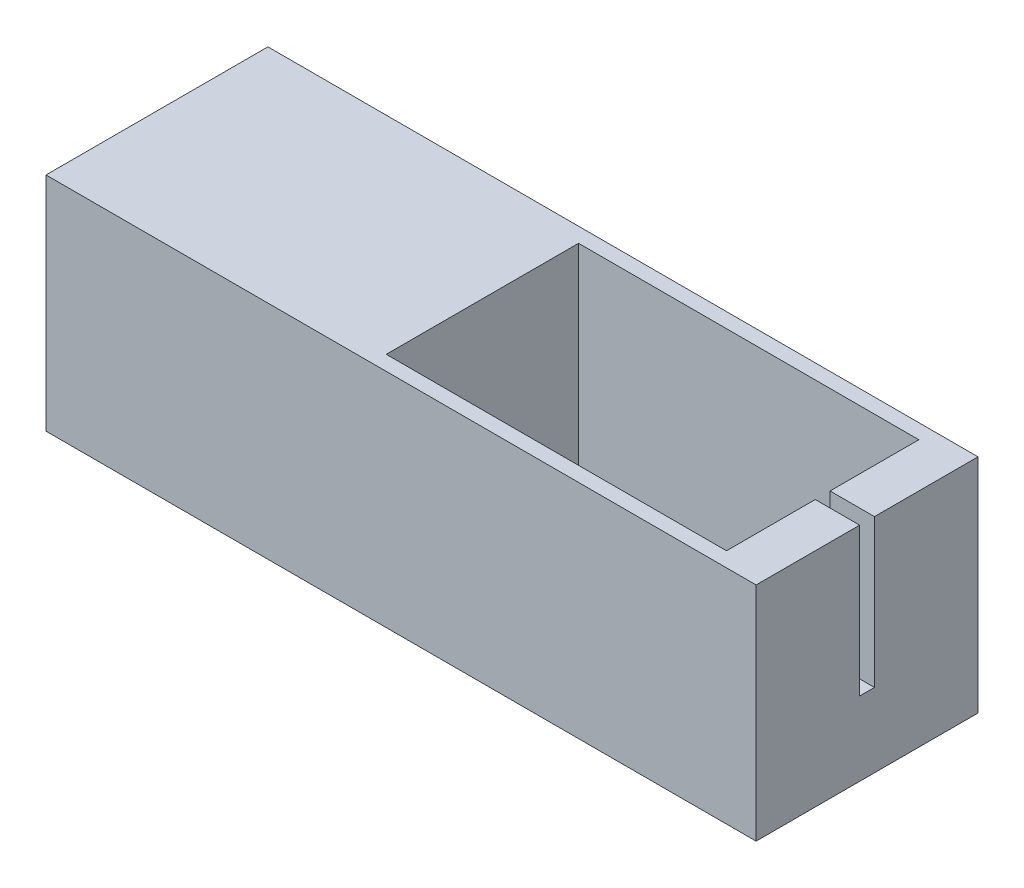
ISO-10303-21;
HEADER;
FILE_DESCRIPTION(('STEP AP214'),'2;1');
FILE_NAME('part.step','',(''),(''),'','','');
FILE_SCHEMA(('AUTOMOTIVE_DESIGN { 1 0 10303 214 1 1 1 1 }'));
ENDSEC;
DATA;
#1=APPLICATION_CONTEXT('core data for automotive mechanical design processes');
#2=APPLICATION_PROTOCOL_DEFINITION('international standard','automotive_design',2000,#1);
#3=PRODUCT_CONTEXT('',#1,'mechanical');
#4=PRODUCT('Part','Part','',(#3));
#5=PRODUCT_RELATED_PRODUCT_CATEGORY('part','',(#4));
#6=PRODUCT_DEFINITION_FORMATION('','',#4);
#7=PRODUCT_DEFINITION_CONTEXT('part definition',#1,'design');
#8=PRODUCT_DEFINITION('design','',#6,#7);
#9=PRODUCT_DEFINITION_SHAPE('','',#8);
#10=(LENGTH_UNIT() NAMED_UNIT(*) SI_UNIT(.MILLI.,.METRE.));
#11=(NAMED_UNIT(*) PLANE_ANGLE_UNIT() SI_UNIT($,.RADIAN.));
#12=(NAMED_UNIT(*) SI_UNIT($,.STERADIAN.) SOLID_ANGLE_UNIT());
#13=UNCERTAINTY_MEASURE_WITH_UNIT(LENGTH_MEASURE(1.E-05),#10,'distance_accuracy_value','');
#14=(GEOMETRIC_REPRESENTATION_CONTEXT(3) GLOBAL_UNCERTAINTY_ASSIGNED_CONTEXT((#13)) GLOBAL_UNIT_ASSIGNED_CONTEXT((#10,
#11,#12)) REPRESENTATION_CONTEXT('',''));
#15=CARTESIAN_POINT('',(0.,0.,0.));
#16=DIRECTION('',(0.,0.,1.));
#17=DIRECTION('',(1.,0.,0.));
#18=AXIS2_PLACEMENT_3D('',#15,#16,#17);
#19=CARTESIAN_POINT('',(0.,15.,0.));
#20=DIRECTION('',(0.,1.,0.));
#21=DIRECTION('',(0.,0.,1.));
#22=AXIS2_PLACEMENT_3D('',#19,#20,#21);
#23=PLANE('',#22);
#24=DIRECTION('',(0.,0.,-1.));
#25=VECTOR('',#24,1.);
#26=CARTESIAN_POINT('',(40.5,15.,0.));
#27=LINE('',#26,#25);
#28=CARTESIAN_POINT('',(40.5,15.,-0.5));
#29=VERTEX_POINT('',#28);
#30=CARTESIAN_POINT('',(40.5,15.,-6.50000000000001));
#31=VERTEX_POINT('',#30);
#32=EDGE_CURVE('E187',#29,#31,#27,.T.);
#33=ORIENTED_EDGE('',*,*,#32,.F.);
#34=DIRECTION('',(1.,0.,0.));
#35=VECTOR('',#34,1.);
#36=CARTESIAN_POINT('',(-4.501,15.,-0.499999999999988));
#37=LINE('',#36,#35);
#38=CARTESIAN_POINT('',(43.5,15.,-0.5));
#39=VERTEX_POINT('',#38);
#40=EDGE_CURVE('E180',#29,#39,#37,.T.);
#41=ORIENTED_EDGE('',*,*,#40,.T.);
#42=DIRECTION('',(0.,0.,1.));
#43=VECTOR('',#42,1.);
#44=CARTESIAN_POINT('',(43.5,15.,7.49999999999999));
#45=LINE('',#44,#43);
#46=CARTESIAN_POINT('',(43.5,15.,-7.50000000000001));
#47=VERTEX_POINT('',#46);
#48=EDGE_CURVE('E248',#47,#39,#45,.T.);
#49=ORIENTED_EDGE('',*,*,#48,.F.);
#50=DIRECTION('',(-1.,0.,0.));
#51=VECTOR('',#50,1.);
#52=CARTESIAN_POINT('',(-4.5,15.,-7.5));
#53=LINE('',#52,#51);
#54=CARTESIAN_POINT('',(-4.5,15.,-7.5));
#55=VERTEX_POINT('',#54);
#56=EDGE_CURVE('E230',#47,#55,#53,.T.);
#57=ORIENTED_EDGE('',*,*,#56,.T.);
#58=DIRECTION('',(0.,0.,1.));
#59=VECTOR('',#58,1.);
#60=CARTESIAN_POINT('',(-4.5,15.,-7.5));
#61=LINE('',#60,#59);
#62=CARTESIAN_POINT('',(-4.5,15.,7.5));
#63=VERTEX_POINT('',#62);
#64=EDGE_CURVE('E245',#55,#63,#61,.T.);
#65=ORIENTED_EDGE('',*,*,#64,.T.);
#66=DIRECTION('',(1.,0.,0.));
#67=VECTOR('',#66,1.);
#68=CARTESIAN_POINT('',(-4.5,15.,7.5));
#69=LINE('',#68,#67);
#70=CARTESIAN_POINT('',(43.5,15.,7.49999999999999));
#71=VERTEX_POINT('',#70);
#72=EDGE_CURVE('E243',#63,#71,#69,.T.);
#73=ORIENTED_EDGE('',*,*,#72,.T.);
#74=CARTESIAN_POINT('',(43.5,15.,0.5));
#75=VERTEX_POINT('',#74);
#76=EDGE_CURVE('E178',#75,#71,#45,.T.);
#77=ORIENTED_EDGE('',*,*,#76,.F.);
#78=DIRECTION('',(1.,0.,0.));
#79=VECTOR('',#78,1.);
#80=CARTESIAN_POINT('',(-4.501,15.,0.500000000000012));
#81=LINE('',#80,#79);
#82=CARTESIAN_POINT('',(40.5,15.,0.500000000000012));
#83=VERTEX_POINT('',#82);
#84=EDGE_CURVE('E163',#83,#75,#81,.T.);
#85=ORIENTED_EDGE('',*,*,#84,.F.);
#86=CARTESIAN_POINT('',(40.5,15.,6.49999999999999));
#87=VERTEX_POINT('',#86);
#88=EDGE_CURVE('E176',#87,#83,#27,.T.);
#89=ORIENTED_EDGE('',*,*,#88,.F.);
#90=DIRECTION('',(1.,0.,0.));
#91=VECTOR('',#90,1.);
#92=CARTESIAN_POINT('',(0.,15.,6.49999999999999));
#93=LINE('',#92,#91);
#94=CARTESIAN_POINT('',(17.5,15.,6.49999999999999));
#95=VERTEX_POINT('',#94);
#96=EDGE_CURVE('E57',#95,#87,#93,.T.);
#97=ORIENTED_EDGE('',*,*,#96,.F.);
#98=DIRECTION('',(0.,0.,1.));
#99=VECTOR('',#98,1.);
#100=CARTESIAN_POINT('',(17.5,15.,0.));
#101=LINE('',#100,#99);
#102=CARTESIAN_POINT('',(17.5,15.,-6.50000000000001));
#103=VERTEX_POINT('',#102);
#104=EDGE_CURVE('E12',#103,#95,#101,.T.);
#105=ORIENTED_EDGE('',*,*,#104,.F.);
#106=DIRECTION('',(-1.,0.,0.));
#107=VECTOR('',#106,1.);
#108=CARTESIAN_POINT('',(0.,15.,-6.50000000000001));
#109=LINE('',#108,#107);
#110=EDGE_CURVE('E189',#31,#103,#109,.T.);
#111=ORIENTED_EDGE('',*,*,#110,.F.);
#112=EDGE_LOOP('',(#33,#41,#49,#57,#65,#73,#77,#85,#89,#97,#105,#111));
#113=FACE_BOUND('',#112,.T.);
#114=ADVANCED_FACE('F49',(#113),#23,.T.);
#115=CARTESIAN_POINT('',(43.5,0.,0.));
#116=DIRECTION('',(1.,0.,0.));
#117=DIRECTION('',(0.,0.,-1.));
#118=AXIS2_PLACEMENT_3D('',#115,#116,#117);
#119=PLANE('',#118);
#120=ORIENTED_EDGE('',*,*,#48,.T.);
#121=DIRECTION('',(0.,-1.,0.));
#122=VECTOR('',#121,1.);
#123=CARTESIAN_POINT('',(43.5,15.,-0.5));
#124=LINE('',#123,#122);
#125=CARTESIAN_POINT('',(43.5,5.,-0.500000000000001));
#126=VERTEX_POINT('',#125);
#127=EDGE_CURVE('E279',#39,#126,#124,.T.);
#128=ORIENTED_EDGE('',*,*,#127,.T.);
#129=DIRECTION('',(0.,0.,1.));
#130=VECTOR('',#129,1.);
#131=CARTESIAN_POINT('',(43.5,5.,-0.500000000000001));
#132=LINE('',#131,#130);
#133=CARTESIAN_POINT('',(43.5,5.,0.499999999999999));
#134=VERTEX_POINT('',#133);
#135=EDGE_CURVE('E285',#126,#134,#132,.T.);
#136=ORIENTED_EDGE('',*,*,#135,.T.);
#137=DIRECTION('',(0.,-1.,0.));
#138=VECTOR('',#137,1.);
#139=CARTESIAN_POINT('',(43.5,15.,0.5));
#140=LINE('',#139,#138);
#141=EDGE_CURVE('E168',#75,#134,#140,.T.);
#142=ORIENTED_EDGE('',*,*,#141,.F.);
#143=ORIENTED_EDGE('',*,*,#76,.T.);
#144=DIRECTION('',(0.,-1.,0.));
#145=VECTOR('',#144,1.);
#146=CARTESIAN_POINT('',(43.5,15.,7.49999999999999));
#147=LINE('',#146,#145);
#148=CARTESIAN_POINT('',(43.5,0.,7.49999999999999));
#149=VERTEX_POINT('',#148);
#150=EDGE_CURVE('E257',#71,#149,#147,.T.);
#151=ORIENTED_EDGE('',*,*,#150,.T.);
#152=DIRECTION('',(0.,0.,-1.));
#153=VECTOR('',#152,1.);
#154=CARTESIAN_POINT('',(43.5,0.,7.49999999999999));
#155=LINE('',#154,#153);
#156=CARTESIAN_POINT('',(43.5,0.,-7.50000000000001));
#157=VERTEX_POINT('',#156);
#158=EDGE_CURVE('E254',#149,#157,#155,.T.);
#159=ORIENTED_EDGE('',*,*,#158,.T.);
#160=DIRECTION('',(0.,1.,0.));
#161=VECTOR('',#160,1.);
#162=CARTESIAN_POINT('',(43.5,15.,-7.50000000000001));
#163=LINE('',#162,#161);
#164=EDGE_CURVE('E251',#157,#47,#163,.T.);
#165=ORIENTED_EDGE('',*,*,#164,.T.);
#166=EDGE_LOOP('',(#120,#128,#136,#142,#143,#151,#159,#165));
#167=FACE_BOUND('',#166,.T.);
#168=ADVANCED_FACE('F321',(#167),#119,.T.);
#169=CARTESIAN_POINT('',(40.5,24.,6.49999999999999));
#170=DIRECTION('',(1.,0.,0.));
#171=DIRECTION('',(0.,0.,-1.));
#172=AXIS2_PLACEMENT_3D('',#169,#170,#171);
#173=PLANE('',#172);
#174=DIRECTION('',(0.,1.,0.));
#175=VECTOR('',#174,1.);
#176=CARTESIAN_POINT('',(40.5,15.,-0.499999999999999));
#177=LINE('',#176,#175);
#178=CARTESIAN_POINT('',(40.5,5.,-0.500000000000001));
#179=VERTEX_POINT('',#178);
#180=EDGE_CURVE('E169',#179,#29,#177,.T.);
#181=ORIENTED_EDGE('',*,*,#180,.T.);
#182=ORIENTED_EDGE('',*,*,#32,.T.);
#183=DIRECTION('',(0.,-1.,0.));
#184=VECTOR('',#183,1.);
#185=CARTESIAN_POINT('',(40.5,24.,-6.50000000000001));
#186=LINE('',#185,#184);
#187=CARTESIAN_POINT('',(40.5,0.,-6.50000000000001));
#188=VERTEX_POINT('',#187);
#189=EDGE_CURVE('E263',#31,#188,#186,.T.);
#190=ORIENTED_EDGE('',*,*,#189,.T.);
#191=DIRECTION('',(0.,0.,1.));
#192=VECTOR('',#191,1.);
#193=CARTESIAN_POINT('',(40.5,0.,6.49999999999999));
#194=LINE('',#193,#192);
#195=CARTESIAN_POINT('',(40.5,0.,6.49999999999999));
#196=VERTEX_POINT('',#195);
#197=EDGE_CURVE('E270',#188,#196,#194,.T.);
#198=ORIENTED_EDGE('',*,*,#197,.T.);
#199=DIRECTION('',(0.,-1.,0.));
#200=VECTOR('',#199,1.);
#201=CARTESIAN_POINT('',(40.5,24.,6.49999999999999));
#202=LINE('',#201,#200);
#203=EDGE_CURVE('E186',#87,#196,#202,.T.);
#204=ORIENTED_EDGE('',*,*,#203,.F.);
#205=ORIENTED_EDGE('',*,*,#88,.T.);
#206=DIRECTION('',(0.,1.,0.));
#207=VECTOR('',#206,1.);
#208=CARTESIAN_POINT('',(40.5,15.,0.500000000000001));
#209=LINE('',#208,#207);
#210=CARTESIAN_POINT('',(40.5,5.,0.499999999999999));
#211=VERTEX_POINT('',#210);
#212=EDGE_CURVE('E160',#211,#83,#209,.T.);
#213=ORIENTED_EDGE('',*,*,#212,.F.);
#214=DIRECTION('',(0.,0.,-1.));
#215=VECTOR('',#214,1.);
#216=CARTESIAN_POINT('',(40.5,5.,-0.500000000000013));
#217=LINE('',#216,#215);
#218=EDGE_CURVE('E179',#211,#179,#217,.T.);
#219=ORIENTED_EDGE('',*,*,#218,.T.);
#220=EDGE_LOOP('',(#181,#182,#190,#198,#204,#205,#213,#219));
#221=FACE_BOUND('',#220,.T.);
#222=ADVANCED_FACE('F184',(#221),#173,.F.);
#223=CARTESIAN_POINT('',(-4.5,0.,-7.5));
#224=DIRECTION('',(-1.,0.,0.));
#225=DIRECTION('',(0.,0.,1.));
#226=AXIS2_PLACEMENT_3D('',#223,#224,#225);
#227=PLANE('',#226);
#228=DIRECTION('',(0.,1.,0.));
#229=VECTOR('',#228,1.);
#230=CARTESIAN_POINT('',(-4.5,0.,7.5));
#231=LINE('',#230,#229);
#232=CARTESIAN_POINT('',(-4.5,0.,7.5));
#233=VERTEX_POINT('',#232);
#234=EDGE_CURVE('E193',#233,#63,#231,.T.);
#235=ORIENTED_EDGE('',*,*,#234,.T.);
#236=ORIENTED_EDGE('',*,*,#64,.F.);
#237=DIRECTION('',(0.,1.,0.));
#238=VECTOR('',#237,1.);
#239=CARTESIAN_POINT('',(-4.5,0.,-7.5));
#240=LINE('',#239,#238);
#241=CARTESIAN_POINT('',(-4.5,0.,-7.5));
#242=VERTEX_POINT('',#241);
#243=EDGE_CURVE('E192',#242,#55,#240,.T.);
#244=ORIENTED_EDGE('',*,*,#243,.F.);
#245=DIRECTION('',(0.,0.,1.));
#246=VECTOR('',#245,1.);
#247=CARTESIAN_POINT('',(-4.5,0.,-7.5));
#248=LINE('',#247,#246);
#249=EDGE_CURVE('E201',#242,#233,#248,.T.);
#250=ORIENTED_EDGE('',*,*,#249,.T.);
#251=EDGE_LOOP('',(#235,#236,#244,#250));
#252=FACE_BOUND('',#251,.T.);
#253=ADVANCED_FACE('F51',(#252),#227,.T.);
#254=CARTESIAN_POINT('',(-4.5,0.,-7.5));
#255=DIRECTION('',(0.,0.,-1.));
#256=DIRECTION('',(-1.,0.,0.));
#257=AXIS2_PLACEMENT_3D('',#254,#255,#256);
#258=PLANE('',#257);
#259=ORIENTED_EDGE('',*,*,#243,.T.);
#260=ORIENTED_EDGE('',*,*,#56,.F.);
#261=ORIENTED_EDGE('',*,*,#164,.F.);
#262=DIRECTION('',(-1.,0.,0.));
#263=VECTOR('',#262,1.);
#264=CARTESIAN_POINT('',(-4.5,0.,-7.5));
#265=LINE('',#264,#263);
#266=EDGE_CURVE('E195',#157,#242,#265,.T.);
#267=ORIENTED_EDGE('',*,*,#266,.T.);
#268=EDGE_LOOP('',(#259,#260,#261,#267));
#269=FACE_BOUND('',#268,.T.);
#270=ADVANCED_FACE('F319',(#269),#258,.T.);
#271=CARTESIAN_POINT('',(-4.5,0.,7.5));
#272=DIRECTION('',(0.,0.,1.));
#273=DIRECTION('',(1.,0.,0.));
#274=AXIS2_PLACEMENT_3D('',#271,#272,#273);
#275=PLANE('',#274);
#276=DIRECTION('',(1.,0.,0.));
#277=VECTOR('',#276,1.);
#278=CARTESIAN_POINT('',(-4.5,0.,7.5));
#279=LINE('',#278,#277);
#280=EDGE_CURVE('E199',#233,#149,#279,.T.);
#281=ORIENTED_EDGE('',*,*,#280,.T.);
#282=ORIENTED_EDGE('',*,*,#150,.F.);
#283=ORIENTED_EDGE('',*,*,#72,.F.);
#284=ORIENTED_EDGE('',*,*,#234,.F.);
#285=EDGE_LOOP('',(#281,#282,#283,#284));
#286=FACE_BOUND('',#285,.T.);
#287=ADVANCED_FACE('F309',(#286),#275,.T.);
#288=CARTESIAN_POINT('',(0.,0.,0.));
#289=DIRECTION('',(0.,1.,0.));
#290=DIRECTION('',(0.,0.,1.));
#291=AXIS2_PLACEMENT_3D('',#288,#289,#290);
#292=PLANE('',#291);
#293=DIRECTION('',(1.,0.,0.));
#294=VECTOR('',#293,1.);
#295=CARTESIAN_POINT('',(17.5,0.,-6.50000000000001));
#296=LINE('',#295,#294);
#297=CARTESIAN_POINT('',(17.5,0.,-6.50000000000001));
#298=VERTEX_POINT('',#297);
#299=EDGE_CURVE('E272',#298,#188,#296,.T.);
#300=ORIENTED_EDGE('',*,*,#299,.F.);
#301=DIRECTION('',(0.,0.,-1.));
#302=VECTOR('',#301,1.);
#303=CARTESIAN_POINT('',(17.5,0.,6.49999999999999));
#304=LINE('',#303,#302);
#305=CARTESIAN_POINT('',(17.5,0.,6.49999999999999));
#306=VERTEX_POINT('',#305);
#307=EDGE_CURVE('E72',#306,#298,#304,.T.);
#308=ORIENTED_EDGE('',*,*,#307,.F.);
#309=DIRECTION('',(-1.,0.,0.));
#310=VECTOR('',#309,1.);
#311=CARTESIAN_POINT('',(17.5,0.,6.49999999999999));
#312=LINE('',#311,#310);
#313=EDGE_CURVE('E264',#196,#306,#312,.T.);
#314=ORIENTED_EDGE('',*,*,#313,.F.);
#315=ORIENTED_EDGE('',*,*,#197,.F.);
#316=EDGE_LOOP('',(#300,#308,#314,#315));
#317=FACE_BOUND('',#316,.T.);
#318=DIRECTION('',(-0.994270148012847,0.,-0.106896551724138));
#319=VECTOR('',#318,1.);
#320=CARTESIAN_POINT('',(14.7084482758621,0.,-1.93882678862505));
#321=LINE('',#320,#319);
#322=CARTESIAN_POINT('',(14.7084482758621,0.,-1.93882678862505));
#323=VERTEX_POINT('',#322);
#324=CARTESIAN_POINT('',(0.374137931034483,0.,-3.47994551804496));
#325=VERTEX_POINT('',#324);
#326=EDGE_CURVE('E209',#323,#325,#321,.T.);
#327=ORIENTED_EDGE('',*,*,#326,.T.);
#328=CARTESIAN_POINT('',(0.,0.,0.));
#329=DIRECTION('',(0.,1.,0.));
#330=DIRECTION('',(0.,0.,1.));
#331=AXIS2_PLACEMENT_3D('',#328,#329,#330);
#332=CIRCLE('',#331,3.5);
#333=CARTESIAN_POINT('',(0.374137931034482,0.,3.47994551804497));
#334=VERTEX_POINT('',#333);
#335=EDGE_CURVE('E220',#325,#334,#332,.T.);
#336=ORIENTED_EDGE('',*,*,#335,.T.);
#337=DIRECTION('',(0.994270148012847,0.,-0.106896551724138));
#338=VECTOR('',#337,1.);
#339=CARTESIAN_POINT('',(0.374137931034482,0.,3.47994551804497));
#340=LINE('',#339,#338);
#341=CARTESIAN_POINT('',(14.7084482758621,0.,1.93882678862505));
#342=VERTEX_POINT('',#341);
#343=EDGE_CURVE('E236',#334,#342,#340,.T.);
#344=ORIENTED_EDGE('',*,*,#343,.T.);
#345=CARTESIAN_POINT('',(14.5,0.,0.));
#346=DIRECTION('',(0.,1.,0.));
#347=DIRECTION('',(0.,0.,1.));
#348=AXIS2_PLACEMENT_3D('',#345,#346,#347);
#349=CIRCLE('',#348,1.95);
#350=EDGE_CURVE('E233',#342,#323,#349,.T.);
#351=ORIENTED_EDGE('',*,*,#350,.T.);
#352=EDGE_LOOP('',(#327,#336,#344,#351));
#353=FACE_BOUND('',#352,.T.);
#354=ORIENTED_EDGE('',*,*,#249,.F.);
#355=ORIENTED_EDGE('',*,*,#266,.F.);
#356=ORIENTED_EDGE('',*,*,#158,.F.);
#357=ORIENTED_EDGE('',*,*,#280,.F.);
#358=EDGE_LOOP('',(#354,#355,#356,#357));
#359=FACE_BOUND('',#358,.T.);
#360=ADVANCED_FACE('F305',(#317,#353,#359),#292,.F.);
#361=CARTESIAN_POINT('',(0.,0.,0.));
#362=DIRECTION('',(0.,1.,0.));
#363=DIRECTION('',(0.,0.,1.));
#364=AXIS2_PLACEMENT_3D('',#361,#362,#363);
#365=CYLINDRICAL_SURFACE('',#364,3.5);
#366=CARTESIAN_POINT('',(0.,5.,0.));
#367=DIRECTION('',(0.,1.,0.));
#368=DIRECTION('',(0.,0.,1.));
#369=AXIS2_PLACEMENT_3D('',#366,#367,#368);
#370=CIRCLE('',#369,3.5);
#371=CARTESIAN_POINT('',(0.374137931034483,5.,-3.47994551804496));
#372=VERTEX_POINT('',#371);
#373=CARTESIAN_POINT('',(0.374137931034482,5.,3.47994551804496));
#374=VERTEX_POINT('',#373);
#375=EDGE_CURVE('E227',#372,#374,#370,.T.);
#376=ORIENTED_EDGE('',*,*,#375,.T.);
#377=DIRECTION('',(0.,1.,0.));
#378=VECTOR('',#377,1.);
#379=CARTESIAN_POINT('',(0.374137931034482,0.,3.47994551804497));
#380=LINE('',#379,#378);
#381=EDGE_CURVE('E205',#334,#374,#380,.T.);
#382=ORIENTED_EDGE('',*,*,#381,.F.);
#383=ORIENTED_EDGE('',*,*,#335,.F.);
#384=DIRECTION('',(0.,1.,0.));
#385=VECTOR('',#384,1.);
#386=CARTESIAN_POINT('',(0.374137931034483,0.,-3.47994551804496));
#387=LINE('',#386,#385);
#388=EDGE_CURVE('E204',#325,#372,#387,.T.);
#389=ORIENTED_EDGE('',*,*,#388,.T.);
#390=EDGE_LOOP('',(#376,#382,#383,#389));
#391=FACE_BOUND('',#390,.T.);
#392=ADVANCED_FACE('F308',(#391),#365,.F.);
#393=CARTESIAN_POINT('',(14.7084482758621,0.,-1.93882678862505));
#394=DIRECTION('',(0.106896551724138,0.,-0.994270148012847));
#395=DIRECTION('',(-0.994270148012847,0.,-0.106896551724138));
#396=AXIS2_PLACEMENT_3D('',#393,#394,#395);
#397=PLANE('',#396);
#398=DIRECTION('',(-0.994270148012847,0.,-0.106896551724138));
#399=VECTOR('',#398,1.);
#400=CARTESIAN_POINT('',(14.7084482758621,5.,-1.93882678862505));
#401=LINE('',#400,#399);
#402=CARTESIAN_POINT('',(14.7084482758621,5.,-1.93882678862505));
#403=VERTEX_POINT('',#402);
#404=EDGE_CURVE('E217',#403,#372,#401,.T.);
#405=ORIENTED_EDGE('',*,*,#404,.T.);
#406=ORIENTED_EDGE('',*,*,#388,.F.);
#407=ORIENTED_EDGE('',*,*,#326,.F.);
#408=DIRECTION('',(0.,1.,0.));
#409=VECTOR('',#408,1.);
#410=CARTESIAN_POINT('',(14.7084482758621,0.,-1.93882678862505));
#411=LINE('',#410,#409);
#412=EDGE_CURVE('E212',#323,#403,#411,.T.);
#413=ORIENTED_EDGE('',*,*,#412,.T.);
#414=EDGE_LOOP('',(#405,#406,#407,#413));
#415=FACE_BOUND('',#414,.T.);
#416=ADVANCED_FACE('F351',(#415),#397,.F.);
#417=CARTESIAN_POINT('',(14.5,0.,0.));
#418=DIRECTION('',(0.,1.,0.));
#419=DIRECTION('',(0.,0.,1.));
#420=AXIS2_PLACEMENT_3D('',#417,#418,#419);
#421=CYLINDRICAL_SURFACE('',#420,1.95);
#422=CARTESIAN_POINT('',(14.5,5.,0.));
#423=DIRECTION('',(0.,1.,0.));
#424=DIRECTION('',(0.,0.,1.));
#425=AXIS2_PLACEMENT_3D('',#422,#423,#424);
#426=CIRCLE('',#425,1.95);
#427=CARTESIAN_POINT('',(14.7084482758621,5.,1.93882678862505));
#428=VERTEX_POINT('',#427);
#429=EDGE_CURVE('E221',#428,#403,#426,.T.);
#430=ORIENTED_EDGE('',*,*,#429,.T.);
#431=ORIENTED_EDGE('',*,*,#412,.F.);
#432=ORIENTED_EDGE('',*,*,#350,.F.);
#433=DIRECTION('',(0.,1.,0.));
#434=VECTOR('',#433,1.);
#435=CARTESIAN_POINT('',(14.7084482758621,0.,1.93882678862505));
#436=LINE('',#435,#434);
#437=EDGE_CURVE('E208',#342,#428,#436,.T.);
#438=ORIENTED_EDGE('',*,*,#437,.T.);
#439=EDGE_LOOP('',(#430,#431,#432,#438));
#440=FACE_BOUND('',#439,.T.);
#441=ADVANCED_FACE('F354',(#440),#421,.F.);
#442=CARTESIAN_POINT('',(0.374137931034482,0.,3.47994551804497));
#443=DIRECTION('',(0.106896551724138,0.,0.994270148012847));
#444=DIRECTION('',(0.994270148012847,0.,-0.106896551724138));
#445=AXIS2_PLACEMENT_3D('',#442,#443,#444);
#446=PLANE('',#445);
#447=DIRECTION('',(0.994270148012847,0.,-0.106896551724138));
#448=VECTOR('',#447,1.);
#449=CARTESIAN_POINT('',(0.374137931034482,5.,3.47994551804497));
#450=LINE('',#449,#448);
#451=EDGE_CURVE('E224',#374,#428,#450,.T.);
#452=ORIENTED_EDGE('',*,*,#451,.T.);
#453=ORIENTED_EDGE('',*,*,#437,.F.);
#454=ORIENTED_EDGE('',*,*,#343,.F.);
#455=ORIENTED_EDGE('',*,*,#381,.T.);
#456=EDGE_LOOP('',(#452,#453,#454,#455));
#457=FACE_BOUND('',#456,.T.);
#458=ADVANCED_FACE('F349',(#457),#446,.F.);
#459=CARTESIAN_POINT('',(0.,5.,0.));
#460=DIRECTION('',(0.,1.,0.));
#461=DIRECTION('',(0.,0.,1.));
#462=AXIS2_PLACEMENT_3D('',#459,#460,#461);
#463=PLANE('',#462);
#464=ORIENTED_EDGE('',*,*,#375,.F.);
#465=ORIENTED_EDGE('',*,*,#404,.F.);
#466=ORIENTED_EDGE('',*,*,#429,.F.);
#467=ORIENTED_EDGE('',*,*,#451,.F.);
#468=EDGE_LOOP('',(#464,#465,#466,#467));
#469=FACE_BOUND('',#468,.T.);
#470=ADVANCED_FACE('F346',(#469),#463,.F.);
#471=CARTESIAN_POINT('',(17.5,24.,6.49999999999999));
#472=DIRECTION('',(-1.,0.,0.));
#473=DIRECTION('',(0.,0.,1.));
#474=AXIS2_PLACEMENT_3D('',#471,#472,#473);
#475=PLANE('',#474);
#476=ORIENTED_EDGE('',*,*,#104,.T.);
#477=DIRECTION('',(0.,-1.,0.));
#478=VECTOR('',#477,1.);
#479=CARTESIAN_POINT('',(17.5,24.,6.49999999999999));
#480=LINE('',#479,#478);
#481=EDGE_CURVE('E260',#95,#306,#480,.T.);
#482=ORIENTED_EDGE('',*,*,#481,.T.);
#483=ORIENTED_EDGE('',*,*,#307,.T.);
#484=DIRECTION('',(0.,-1.,0.));
#485=VECTOR('',#484,1.);
#486=CARTESIAN_POINT('',(17.5,24.,-6.50000000000001));
#487=LINE('',#486,#485);
#488=EDGE_CURVE('E261',#103,#298,#487,.T.);
#489=ORIENTED_EDGE('',*,*,#488,.F.);
#490=EDGE_LOOP('',(#476,#482,#483,#489));
#491=FACE_BOUND('',#490,.T.);
#492=ADVANCED_FACE('F298',(#491),#475,.F.);
#493=CARTESIAN_POINT('',(17.5,24.,6.49999999999999));
#494=DIRECTION('',(0.,0.,1.));
#495=DIRECTION('',(1.,0.,0.));
#496=AXIS2_PLACEMENT_3D('',#493,#494,#495);
#497=PLANE('',#496);
#498=ORIENTED_EDGE('',*,*,#96,.T.);
#499=ORIENTED_EDGE('',*,*,#203,.T.);
#500=ORIENTED_EDGE('',*,*,#313,.T.);
#501=ORIENTED_EDGE('',*,*,#481,.F.);
#502=EDGE_LOOP('',(#498,#499,#500,#501));
#503=FACE_BOUND('',#502,.T.);
#504=ADVANCED_FACE('F301',(#503),#497,.F.);
#505=CARTESIAN_POINT('',(17.5,24.,-6.50000000000001));
#506=DIRECTION('',(0.,0.,-1.));
#507=DIRECTION('',(-1.,0.,0.));
#508=AXIS2_PLACEMENT_3D('',#505,#506,#507);
#509=PLANE('',#508);
#510=ORIENTED_EDGE('',*,*,#110,.T.);
#511=ORIENTED_EDGE('',*,*,#488,.T.);
#512=ORIENTED_EDGE('',*,*,#299,.T.);
#513=ORIENTED_EDGE('',*,*,#189,.F.);
#514=EDGE_LOOP('',(#510,#511,#512,#513));
#515=FACE_BOUND('',#514,.T.);
#516=ADVANCED_FACE('F296',(#515),#509,.F.);
#517=CARTESIAN_POINT('',(-4.501,5.,-0.499999999999989));
#518=DIRECTION('',(0.,1.,0.));
#519=DIRECTION('',(-1.,0.,0.));
#520=AXIS2_PLACEMENT_3D('',#517,#518,#519);
#521=PLANE('',#520);
#522=DIRECTION('',(1.,0.,0.));
#523=VECTOR('',#522,1.);
#524=CARTESIAN_POINT('',(-4.501,5.,0.500000000000011));
#525=LINE('',#524,#523);
#526=EDGE_CURVE('E64',#211,#134,#525,.T.);
#527=ORIENTED_EDGE('',*,*,#526,.T.);
#528=ORIENTED_EDGE('',*,*,#135,.F.);
#529=DIRECTION('',(1.,0.,0.));
#530=VECTOR('',#529,1.);
#531=CARTESIAN_POINT('',(-4.501,5.,-0.499999999999989));
#532=LINE('',#531,#530);
#533=EDGE_CURVE('E278',#179,#126,#532,.T.);
#534=ORIENTED_EDGE('',*,*,#533,.F.);
#535=ORIENTED_EDGE('',*,*,#218,.F.);
#536=EDGE_LOOP('',(#527,#528,#534,#535));
#537=FACE_BOUND('',#536,.T.);
#538=ADVANCED_FACE('F328',(#537),#521,.T.);
#539=CARTESIAN_POINT('',(-4.501,15.,-0.499999999999988));
#540=DIRECTION('',(0.,0.,1.));
#541=DIRECTION('',(1.,0.,0.));
#542=AXIS2_PLACEMENT_3D('',#539,#540,#541);
#543=PLANE('',#542);
#544=ORIENTED_EDGE('',*,*,#533,.T.);
#545=ORIENTED_EDGE('',*,*,#127,.F.);
#546=ORIENTED_EDGE('',*,*,#40,.F.);
#547=ORIENTED_EDGE('',*,*,#180,.F.);
#548=EDGE_LOOP('',(#544,#545,#546,#547));
#549=FACE_BOUND('',#548,.T.);
#550=ADVANCED_FACE('F329',(#549),#543,.T.);
#551=CARTESIAN_POINT('',(-4.501,15.,0.500000000000012));
#552=DIRECTION('',(0.,0.,1.));
#553=DIRECTION('',(1.,0.,0.));
#554=AXIS2_PLACEMENT_3D('',#551,#552,#553);
#555=PLANE('',#554);
#556=ORIENTED_EDGE('',*,*,#212,.T.);
#557=ORIENTED_EDGE('',*,*,#84,.T.);
#558=ORIENTED_EDGE('',*,*,#141,.T.);
#559=ORIENTED_EDGE('',*,*,#526,.F.);
#560=EDGE_LOOP('',(#556,#557,#558,#559));
#561=FACE_BOUND('',#560,.T.);
#562=ADVANCED_FACE('F162',(#561),#555,.F.);
#563=CLOSED_SHELL('',(#114,#168,#222,#253,#270,#287,#360,#392,#416,#441,#458,#470,#492,#504,
#516,#538,#550,#562));
#564=MANIFOLD_SOLID_BREP('B2',#563);
#565=CARTESIAN_POINT('',(0.,5.,0.));
#566=DIRECTION('',(0.,-1.,0.));
#567=DIRECTION('',(0.,0.,-1.));
#568=AXIS2_PLACEMENT_3D('',#565,#566,#567);
#569=CYLINDRICAL_SURFACE('',#568,3.5);
#570=CARTESIAN_POINT('',(0.,5.,0.));
#571=DIRECTION('',(0.,1.,0.));
#572=DIRECTION('',(0.,0.,1.));
#573=AXIS2_PLACEMENT_3D('',#570,#571,#572);
#574=CIRCLE('',#573,3.5);
#575=CARTESIAN_POINT('',(0.374137931034483,5.,-3.47994551804497));
#576=VERTEX_POINT('',#575);
#577=CARTESIAN_POINT('',(0.374137931034483,5.,3.47994551804496));
#578=VERTEX_POINT('',#577);
#579=EDGE_CURVE('E47',#576,#578,#574,.T.);
#580=ORIENTED_EDGE('',*,*,#579,.F.);
#581=DIRECTION('',(0.,1.,0.));
#582=VECTOR('',#581,1.);
#583=CARTESIAN_POINT('',(0.374137931034483,4.,-3.47994551804496));
#584=LINE('',#583,#582);
#585=CARTESIAN_POINT('',(0.374137931034483,4.,-3.47994551804496));
#586=VERTEX_POINT('',#585);
#587=EDGE_CURVE('E610',#586,#576,#584,.T.);
#588=ORIENTED_EDGE('',*,*,#587,.F.);
#589=CARTESIAN_POINT('',(0.,4.,0.));
#590=DIRECTION('',(0.,-1.,0.));
#591=DIRECTION('',(0.,0.,1.));
#592=AXIS2_PLACEMENT_3D('',#589,#590,#591);
#593=CIRCLE('',#592,3.5);
#594=CARTESIAN_POINT('',(0.374137931034483,4.,3.47994551804496));
#595=VERTEX_POINT('',#594);
#596=EDGE_CURVE('E564',#586,#595,#593,.T.);
#597=ORIENTED_EDGE('',*,*,#596,.T.);
#598=DIRECTION('',(0.,1.,0.));
#599=VECTOR('',#598,1.);
#600=CARTESIAN_POINT('',(0.374137931034483,4.,3.47994551804496));
#601=LINE('',#600,#599);
#602=EDGE_CURVE('E588',#595,#578,#601,.T.);
#603=ORIENTED_EDGE('',*,*,#602,.T.);
#604=EDGE_LOOP('',(#580,#588,#597,#603));
#605=FACE_BOUND('',#604,.T.);
#606=CARTESIAN_POINT('',(0.,0.,0.));
#607=DIRECTION('',(0.,1.,0.));
#608=DIRECTION('',(0.,0.,1.));
#609=AXIS2_PLACEMENT_3D('',#606,#607,#608);
#610=CIRCLE('',#609,3.5);
#611=CARTESIAN_POINT('',(0.,0.,3.5));
#612=VERTEX_POINT('',#611);
#613=EDGE_CURVE('E545',#612,#612,#610,.T.);
#614=ORIENTED_EDGE('',*,*,#613,.T.);
#615=EDGE_LOOP('',(#614));
#616=FACE_BOUND('',#615,.T.);
#617=ADVANCED_FACE('F542',(#605,#616),#569,.T.);
#618=CARTESIAN_POINT('',(0.,5.,0.));
#619=DIRECTION('',(0.,1.,0.));
#620=DIRECTION('',(0.,0.,1.));
#621=AXIS2_PLACEMENT_3D('',#618,#619,#620);
#622=PLANE('',#621);
#623=ORIENTED_EDGE('',*,*,#579,.T.);
#624=DIRECTION('',(0.994270148012847,0.,-0.106896551724138));
#625=VECTOR('',#624,1.);
#626=CARTESIAN_POINT('',(0.374137931034483,5.,3.47994551804496));
#627=LINE('',#626,#625);
#628=CARTESIAN_POINT('',(14.7084482758621,5.,1.93882678862505));
#629=VERTEX_POINT('',#628);
#630=EDGE_CURVE('E606',#578,#629,#627,.T.);
#631=ORIENTED_EDGE('',*,*,#630,.T.);
#632=CARTESIAN_POINT('',(14.5,5.,0.));
#633=DIRECTION('',(0.,1.,0.));
#634=DIRECTION('',(0.,0.,1.));
#635=AXIS2_PLACEMENT_3D('',#632,#633,#634);
#636=CIRCLE('',#635,1.95);
#637=CARTESIAN_POINT('',(14.7084482758621,5.,-1.93882678862505));
#638=VERTEX_POINT('',#637);
#639=EDGE_CURVE('E594',#629,#638,#636,.T.);
#640=ORIENTED_EDGE('',*,*,#639,.T.);
#641=DIRECTION('',(-0.994270148012847,0.,-0.106896551724138));
#642=VECTOR('',#641,1.);
#643=CARTESIAN_POINT('',(14.7084482758621,5.,-1.93882678862505));
#644=LINE('',#643,#642);
#645=EDGE_CURVE('E555',#638,#576,#644,.T.);
#646=ORIENTED_EDGE('',*,*,#645,.T.);
#647=EDGE_LOOP('',(#623,#631,#640,#646));
#648=FACE_BOUND('',#647,.T.);
#649=ADVANCED_FACE('F626',(#648),#622,.T.);
#650=CARTESIAN_POINT('',(0.,0.,0.));
#651=DIRECTION('',(0.,1.,0.));
#652=DIRECTION('',(0.,0.,1.));
#653=AXIS2_PLACEMENT_3D('',#650,#651,#652);
#654=PLANE('',#653);
#655=CARTESIAN_POINT('',(0.,0.,0.));
#656=DIRECTION('',(0.,-1.,0.));
#657=DIRECTION('',(0.,0.,-1.));
#658=AXIS2_PLACEMENT_3D('',#655,#656,#657);
#659=CIRCLE('',#658,2.5);
#660=CARTESIAN_POINT('',(0.,0.,-2.5));
#661=VERTEX_POINT('',#660);
#662=EDGE_CURVE('E612',#661,#661,#659,.T.);
#663=ORIENTED_EDGE('',*,*,#662,.F.);
#664=EDGE_LOOP('',(#663));
#665=FACE_BOUND('',#664,.T.);
#666=ORIENTED_EDGE('',*,*,#613,.F.);
#667=EDGE_LOOP('',(#666));
#668=FACE_BOUND('',#667,.T.);
#669=ADVANCED_FACE('F623',(#665,#668),#654,.F.);
#670=CARTESIAN_POINT('',(0.,4.5,0.));
#671=DIRECTION('',(0.,-1.,0.));
#672=DIRECTION('',(0.,0.,-1.));
#673=AXIS2_PLACEMENT_3D('',#670,#671,#672);
#674=CYLINDRICAL_SURFACE('',#673,2.5);
#675=CARTESIAN_POINT('',(0.,4.5,0.));
#676=DIRECTION('',(0.,-1.,0.));
#677=DIRECTION('',(0.,0.,-1.));
#678=AXIS2_PLACEMENT_3D('',#675,#676,#677);
#679=CIRCLE('',#678,2.5);
#680=CARTESIAN_POINT('',(0.,4.5,-2.5));
#681=VERTEX_POINT('',#680);
#682=EDGE_CURVE('E615',#681,#681,#679,.T.);
#683=ORIENTED_EDGE('',*,*,#682,.F.);
#684=EDGE_LOOP('',(#683));
#685=FACE_BOUND('',#684,.T.);
#686=ORIENTED_EDGE('',*,*,#662,.T.);
#687=EDGE_LOOP('',(#686));
#688=FACE_BOUND('',#687,.T.);
#689=ADVANCED_FACE('F621',(#685,#688),#674,.F.);
#690=CARTESIAN_POINT('',(0.,4.5,0.));
#691=DIRECTION('',(0.,-1.,0.));
#692=DIRECTION('',(0.,0.,-1.));
#693=AXIS2_PLACEMENT_3D('',#690,#691,#692);
#694=PLANE('',#693);
#695=ORIENTED_EDGE('',*,*,#682,.T.);
#696=EDGE_LOOP('',(#695));
#697=FACE_BOUND('',#696,.T.);
#698=ADVANCED_FACE('F641',(#697),#694,.T.);
#699=CARTESIAN_POINT('',(14.7084482758621,4.,-1.93882678862505));
#700=DIRECTION('',(0.106896551724138,0.,-0.994270148012847));
#701=DIRECTION('',(-0.994270148012847,0.,-0.106896551724138));
#702=AXIS2_PLACEMENT_3D('',#699,#700,#701);
#703=PLANE('',#702);
#704=ORIENTED_EDGE('',*,*,#645,.F.);
#705=DIRECTION('',(0.,1.,0.));
#706=VECTOR('',#705,1.);
#707=CARTESIAN_POINT('',(14.7084482758621,4.,-1.93882678862505));
#708=LINE('',#707,#706);
#709=CARTESIAN_POINT('',(14.7084482758621,4.,-1.93882678862505));
#710=VERTEX_POINT('',#709);
#711=EDGE_CURVE('E582',#710,#638,#708,.T.);
#712=ORIENTED_EDGE('',*,*,#711,.F.);
#713=DIRECTION('',(-0.994270148012847,0.,-0.106896551724138));
#714=VECTOR('',#713,1.);
#715=CARTESIAN_POINT('',(14.7084482758621,4.,-1.93882678862505));
#716=LINE('',#715,#714);
#717=EDGE_CURVE('E599',#710,#586,#716,.T.);
#718=ORIENTED_EDGE('',*,*,#717,.T.);
#719=ORIENTED_EDGE('',*,*,#587,.T.);
#720=EDGE_LOOP('',(#704,#712,#718,#719));
#721=FACE_BOUND('',#720,.T.);
#722=ADVANCED_FACE('F639',(#721),#703,.T.);
#723=CARTESIAN_POINT('',(14.5,4.,0.));
#724=DIRECTION('',(0.,1.,0.));
#725=DIRECTION('',(0.,0.,1.));
#726=AXIS2_PLACEMENT_3D('',#723,#724,#725);
#727=CYLINDRICAL_SURFACE('',#726,1.95);
#728=ORIENTED_EDGE('',*,*,#639,.F.);
#729=DIRECTION('',(0.,1.,0.));
#730=VECTOR('',#729,1.);
#731=CARTESIAN_POINT('',(14.7084482758621,4.,1.93882678862505));
#732=LINE('',#731,#730);
#733=CARTESIAN_POINT('',(14.7084482758621,4.,1.93882678862505));
#734=VERTEX_POINT('',#733);
#735=EDGE_CURVE('E590',#734,#629,#732,.T.);
#736=ORIENTED_EDGE('',*,*,#735,.F.);
#737=CARTESIAN_POINT('',(14.5,4.,0.));
#738=DIRECTION('',(0.,1.,0.));
#739=DIRECTION('',(0.,0.,1.));
#740=AXIS2_PLACEMENT_3D('',#737,#738,#739);
#741=CIRCLE('',#740,1.95);
#742=EDGE_CURVE('E593',#734,#710,#741,.T.);
#743=ORIENTED_EDGE('',*,*,#742,.T.);
#744=ORIENTED_EDGE('',*,*,#711,.T.);
#745=EDGE_LOOP('',(#728,#736,#743,#744));
#746=FACE_BOUND('',#745,.T.);
#747=ADVANCED_FACE('F592',(#746),#727,.T.);
#748=CARTESIAN_POINT('',(0.374137931034483,4.,3.47994551804496));
#749=DIRECTION('',(0.106896551724138,0.,0.994270148012847));
#750=DIRECTION('',(0.994270148012847,0.,-0.106896551724138));
#751=AXIS2_PLACEMENT_3D('',#748,#749,#750);
#752=PLANE('',#751);
#753=ORIENTED_EDGE('',*,*,#630,.F.);
#754=ORIENTED_EDGE('',*,*,#602,.F.);
#755=DIRECTION('',(0.994270148012847,0.,-0.106896551724138));
#756=VECTOR('',#755,1.);
#757=CARTESIAN_POINT('',(0.374137931034483,4.,3.47994551804496));
#758=LINE('',#757,#756);
#759=EDGE_CURVE('E598',#595,#734,#758,.T.);
#760=ORIENTED_EDGE('',*,*,#759,.T.);
#761=ORIENTED_EDGE('',*,*,#735,.T.);
#762=EDGE_LOOP('',(#753,#754,#760,#761));
#763=FACE_BOUND('',#762,.T.);
#764=ADVANCED_FACE('F601',(#763),#752,.T.);
#765=CARTESIAN_POINT('',(0.,4.,0.));
#766=DIRECTION('',(0.,1.,0.));
#767=DIRECTION('',(0.,0.,1.));
#768=AXIS2_PLACEMENT_3D('',#765,#766,#767);
#769=PLANE('',#768);
#770=ORIENTED_EDGE('',*,*,#596,.F.);
#771=ORIENTED_EDGE('',*,*,#717,.F.);
#772=ORIENTED_EDGE('',*,*,#742,.F.);
#773=ORIENTED_EDGE('',*,*,#759,.F.);
#774=EDGE_LOOP('',(#770,#771,#772,#773));
#775=FACE_BOUND('',#774,.T.);
#776=ADVANCED_FACE('F597',(#775),#769,.F.);
#777=CLOSED_SHELL('',(#617,#649,#669,#689,#698,#722,#747,#764,#776));
#778=MANIFOLD_SOLID_BREP('B6_NOT_SHOWN',#777);
#779=ADVANCED_BREP_SHAPE_REPRESENTATION('',(#18,#564,#778),#14);
#780=SHAPE_DEFINITION_REPRESENTATION(#9,#779);
ENDSEC;
END-ISO-10303-21;
